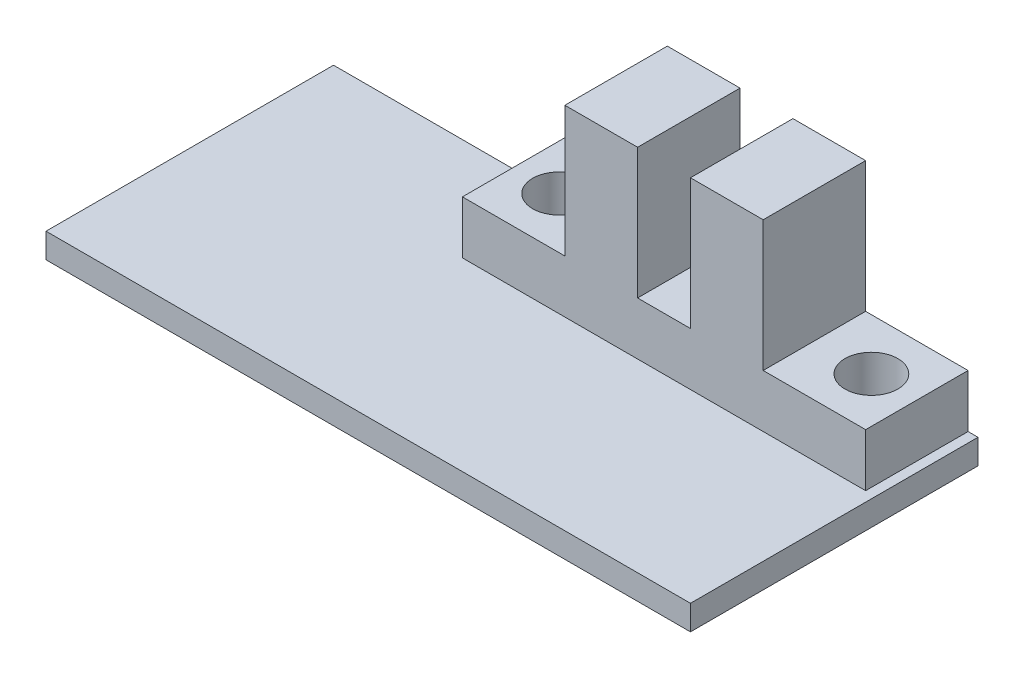
ISO-10303-21;
HEADER;
FILE_DESCRIPTION(('STEP AP214'),'2;1');
FILE_NAME('part.step','',(''),(''),'','','');
FILE_SCHEMA(('AUTOMOTIVE_DESIGN { 1 0 10303 214 1 1 1 1 }'));
ENDSEC;
DATA;
#1=APPLICATION_CONTEXT('core data for automotive mechanical design processes');
#2=APPLICATION_PROTOCOL_DEFINITION('international standard','automotive_design',2000,#1);
#3=PRODUCT_CONTEXT('',#1,'mechanical');
#4=PRODUCT('Part','Part','',(#3));
#5=PRODUCT_RELATED_PRODUCT_CATEGORY('part','',(#4));
#6=PRODUCT_DEFINITION_FORMATION('','',#4);
#7=PRODUCT_DEFINITION_CONTEXT('part definition',#1,'design');
#8=PRODUCT_DEFINITION('design','',#6,#7);
#9=PRODUCT_DEFINITION_SHAPE('','',#8);
#10=(LENGTH_UNIT() NAMED_UNIT(*) SI_UNIT(.MILLI.,.METRE.));
#11=(NAMED_UNIT(*) PLANE_ANGLE_UNIT() SI_UNIT($,.RADIAN.));
#12=(NAMED_UNIT(*) SI_UNIT($,.STERADIAN.) SOLID_ANGLE_UNIT());
#13=UNCERTAINTY_MEASURE_WITH_UNIT(LENGTH_MEASURE(1.E-05),#10,'distance_accuracy_value','');
#14=(GEOMETRIC_REPRESENTATION_CONTEXT(3) GLOBAL_UNCERTAINTY_ASSIGNED_CONTEXT((#13)) GLOBAL_UNIT_ASSIGNED_CONTEXT((#10,
#11,#12)) REPRESENTATION_CONTEXT('',''));
#15=CARTESIAN_POINT('',(0.,0.,0.));
#16=DIRECTION('',(0.,0.,1.));
#17=DIRECTION('',(1.,0.,0.));
#18=AXIS2_PLACEMENT_3D('',#15,#16,#17);
#19=CARTESIAN_POINT('',(0.,4.7,0.));
#20=DIRECTION('',(0.,1.,0.));
#21=DIRECTION('',(0.,0.,1.));
#22=AXIS2_PLACEMENT_3D('',#19,#20,#21);
#23=PLANE('',#22);
#24=DIRECTION('',(1.,0.,0.));
#25=VECTOR('',#24,1.);
#26=CARTESIAN_POINT('',(-5.49999999999999,4.7,-2.5));
#27=LINE('',#26,#25);
#28=CARTESIAN_POINT('',(5.10000000000001,4.7,-2.5));
#29=VERTEX_POINT('',#28);
#30=CARTESIAN_POINT('',(8.30000000000001,4.7,-2.5));
#31=VERTEX_POINT('',#30);
#32=EDGE_CURVE('E167',#29,#31,#27,.T.);
#33=ORIENTED_EDGE('',*,*,#32,.T.);
#34=DIRECTION('',(0.,0.,1.));
#35=VECTOR('',#34,1.);
#36=CARTESIAN_POINT('',(8.30000000000001,4.7,-8.7));
#37=LINE('',#36,#35);
#38=CARTESIAN_POINT('',(8.30000000000001,4.7,-8.7));
#39=VERTEX_POINT('',#38);
#40=EDGE_CURVE('E165',#39,#31,#37,.T.);
#41=ORIENTED_EDGE('',*,*,#40,.F.);
#42=DIRECTION('',(-1.,0.,0.));
#43=VECTOR('',#42,1.);
#44=CARTESIAN_POINT('',(-5.49999999999999,4.7,-8.7));
#45=LINE('',#44,#43);
#46=CARTESIAN_POINT('',(5.10000000000001,4.7,-8.7));
#47=VERTEX_POINT('',#46);
#48=EDGE_CURVE('E150',#39,#47,#45,.T.);
#49=ORIENTED_EDGE('',*,*,#48,.T.);
#50=DIRECTION('',(0.,0.,-1.));
#51=VECTOR('',#50,1.);
#52=CARTESIAN_POINT('',(5.10000000000001,4.7,-8.7));
#53=LINE('',#52,#51);
#54=EDGE_CURVE('E195',#29,#47,#53,.T.);
#55=ORIENTED_EDGE('',*,*,#54,.F.);
#56=EDGE_LOOP('',(#33,#41,#49,#55));
#57=FACE_BOUND('',#56,.T.);
#58=ADVANCED_FACE('F39',(#57),#23,.T.);
#59=CARTESIAN_POINT('',(16.15,4.7,-5.6));
#60=DIRECTION('',(0.,1.,0.));
#61=DIRECTION('',(0.,0.,1.));
#62=AXIS2_PLACEMENT_3D('',#59,#60,#61);
#63=CIRCLE('',#62,1.6);
#64=CARTESIAN_POINT('',(16.15,4.7,-4.));
#65=VERTEX_POINT('',#64);
#66=EDGE_CURVE('E328',#65,#65,#63,.T.);
#67=ORIENTED_EDGE('',*,*,#66,.F.);
#68=EDGE_LOOP('',(#67));
#69=FACE_BOUND('',#68,.T.);
#70=CARTESIAN_POINT('',(18.9,4.7,-8.7));
#71=VERTEX_POINT('',#70);
#72=CARTESIAN_POINT('',(12.7,4.7,-8.7));
#73=VERTEX_POINT('',#72);
#74=EDGE_CURVE('E54',#71,#73,#45,.T.);
#75=ORIENTED_EDGE('',*,*,#74,.T.);
#76=DIRECTION('',(0.,0.,-1.));
#77=VECTOR('',#76,1.);
#78=CARTESIAN_POINT('',(12.7,4.7,-8.7));
#79=LINE('',#78,#77);
#80=CARTESIAN_POINT('',(12.7,4.7,-2.5));
#81=VERTEX_POINT('',#80);
#82=EDGE_CURVE('E58',#81,#73,#79,.T.);
#83=ORIENTED_EDGE('',*,*,#82,.F.);
#84=CARTESIAN_POINT('',(18.9,4.7,-2.5));
#85=VERTEX_POINT('',#84);
#86=EDGE_CURVE('E218',#81,#85,#27,.T.);
#87=ORIENTED_EDGE('',*,*,#86,.T.);
#88=DIRECTION('',(0.,0.,-1.));
#89=VECTOR('',#88,1.);
#90=CARTESIAN_POINT('',(18.9,4.7,-8.7));
#91=LINE('',#90,#89);
#92=EDGE_CURVE('E222',#85,#71,#91,.T.);
#93=ORIENTED_EDGE('',*,*,#92,.T.);
#94=EDGE_LOOP('',(#75,#83,#87,#93));
#95=FACE_BOUND('',#94,.T.);
#96=ADVANCED_FACE('F311',(#69,#95),#23,.T.);
#97=CARTESIAN_POINT('',(-2.74999999999999,4.7,-5.6));
#98=DIRECTION('',(0.,1.,0.));
#99=DIRECTION('',(0.,0.,1.));
#100=AXIS2_PLACEMENT_3D('',#97,#98,#99);
#101=CIRCLE('',#100,1.6);
#102=CARTESIAN_POINT('',(-2.74999999999999,4.7,-4.));
#103=VERTEX_POINT('',#102);
#104=EDGE_CURVE('E331',#103,#103,#101,.T.);
#105=ORIENTED_EDGE('',*,*,#104,.F.);
#106=EDGE_LOOP('',(#105));
#107=FACE_BOUND('',#106,.T.);
#108=DIRECTION('',(0.,0.,1.));
#109=VECTOR('',#108,1.);
#110=CARTESIAN_POINT('',(0.700000000000006,4.7,-8.7));
#111=LINE('',#110,#109);
#112=CARTESIAN_POINT('',(0.700000000000006,4.7,-8.7));
#113=VERTEX_POINT('',#112);
#114=CARTESIAN_POINT('',(0.700000000000006,4.7,-2.5));
#115=VERTEX_POINT('',#114);
#116=EDGE_CURVE('E171',#113,#115,#111,.T.);
#117=ORIENTED_EDGE('',*,*,#116,.F.);
#118=CARTESIAN_POINT('',(-5.49999999999999,4.7,-8.7));
#119=VERTEX_POINT('',#118);
#120=EDGE_CURVE('E162',#113,#119,#45,.T.);
#121=ORIENTED_EDGE('',*,*,#120,.T.);
#122=DIRECTION('',(0.,0.,1.));
#123=VECTOR('',#122,1.);
#124=CARTESIAN_POINT('',(-5.49999999999999,4.7,-8.7));
#125=LINE('',#124,#123);
#126=CARTESIAN_POINT('',(-5.49999999999999,4.7,-2.5));
#127=VERTEX_POINT('',#126);
#128=EDGE_CURVE('E215',#119,#127,#125,.T.);
#129=ORIENTED_EDGE('',*,*,#128,.T.);
#130=EDGE_CURVE('E220',#127,#115,#27,.T.);
#131=ORIENTED_EDGE('',*,*,#130,.T.);
#132=EDGE_LOOP('',(#117,#121,#129,#131));
#133=FACE_BOUND('',#132,.T.);
#134=ADVANCED_FACE('F295',(#107,#133),#23,.T.);
#135=CARTESIAN_POINT('',(19.5,1.5,-8.7));
#136=DIRECTION('',(-1.,0.,0.));
#137=DIRECTION('',(0.,0.,1.));
#138=AXIS2_PLACEMENT_3D('',#135,#136,#137);
#139=PLANE('',#138);
#140=DIRECTION('',(0.,0.,-1.));
#141=VECTOR('',#140,1.);
#142=CARTESIAN_POINT('',(19.5,0.,-8.7));
#143=LINE('',#142,#141);
#144=CARTESIAN_POINT('',(19.5,0.,8.7));
#145=VERTEX_POINT('',#144);
#146=CARTESIAN_POINT('',(19.5,0.,-8.7));
#147=VERTEX_POINT('',#146);
#148=EDGE_CURVE('E243',#145,#147,#143,.T.);
#149=ORIENTED_EDGE('',*,*,#148,.T.);
#150=DIRECTION('',(0.,-1.,0.));
#151=VECTOR('',#150,1.);
#152=CARTESIAN_POINT('',(19.5,1.5,-8.7));
#153=LINE('',#152,#151);
#154=CARTESIAN_POINT('',(19.5,1.5,-8.7));
#155=VERTEX_POINT('',#154);
#156=EDGE_CURVE('E11',#155,#147,#153,.T.);
#157=ORIENTED_EDGE('',*,*,#156,.F.);
#158=DIRECTION('',(0.,0.,-1.));
#159=VECTOR('',#158,1.);
#160=CARTESIAN_POINT('',(19.5,1.5,-8.7));
#161=LINE('',#160,#159);
#162=CARTESIAN_POINT('',(19.5,1.5,8.7));
#163=VERTEX_POINT('',#162);
#164=EDGE_CURVE('E244',#163,#155,#161,.T.);
#165=ORIENTED_EDGE('',*,*,#164,.F.);
#166=DIRECTION('',(0.,-1.,0.));
#167=VECTOR('',#166,1.);
#168=CARTESIAN_POINT('',(19.5,1.5,8.7));
#169=LINE('',#168,#167);
#170=EDGE_CURVE('E255',#163,#145,#169,.T.);
#171=ORIENTED_EDGE('',*,*,#170,.T.);
#172=EDGE_LOOP('',(#149,#157,#165,#171));
#173=FACE_BOUND('',#172,.T.);
#174=ADVANCED_FACE('F41',(#173),#139,.F.);
#175=CARTESIAN_POINT('',(-19.5,1.5,-8.7));
#176=DIRECTION('',(0.,0.,1.));
#177=DIRECTION('',(1.,0.,0.));
#178=AXIS2_PLACEMENT_3D('',#175,#176,#177);
#179=PLANE('',#178);
#180=DIRECTION('',(-1.,0.,0.));
#181=VECTOR('',#180,1.);
#182=CARTESIAN_POINT('',(-19.5,0.,-8.7));
#183=LINE('',#182,#181);
#184=CARTESIAN_POINT('',(-19.5,0.,-8.7));
#185=VERTEX_POINT('',#184);
#186=EDGE_CURVE('E258',#147,#185,#183,.T.);
#187=ORIENTED_EDGE('',*,*,#186,.T.);
#188=DIRECTION('',(0.,-1.,0.));
#189=VECTOR('',#188,1.);
#190=CARTESIAN_POINT('',(-19.5,1.5,-8.7));
#191=LINE('',#190,#189);
#192=CARTESIAN_POINT('',(-19.5,1.5,-8.7));
#193=VERTEX_POINT('',#192);
#194=EDGE_CURVE('E47',#193,#185,#191,.T.);
#195=ORIENTED_EDGE('',*,*,#194,.F.);
#196=DIRECTION('',(-1.,0.,0.));
#197=VECTOR('',#196,1.);
#198=CARTESIAN_POINT('',(-19.5,1.5,-8.7));
#199=LINE('',#198,#197);
#200=CARTESIAN_POINT('',(-5.49999999999999,1.5,-8.7));
#201=VERTEX_POINT('',#200);
#202=EDGE_CURVE('E247',#201,#193,#199,.T.);
#203=ORIENTED_EDGE('',*,*,#202,.F.);
#204=DIRECTION('',(0.,-1.,0.));
#205=VECTOR('',#204,1.);
#206=CARTESIAN_POINT('',(-5.49999999999999,4.7,-8.7));
#207=LINE('',#206,#205);
#208=EDGE_CURVE('E224',#119,#201,#207,.T.);
#209=ORIENTED_EDGE('',*,*,#208,.F.);
#210=ORIENTED_EDGE('',*,*,#120,.F.);
#211=DIRECTION('',(0.,-1.,0.));
#212=VECTOR('',#211,1.);
#213=CARTESIAN_POINT('',(0.700000000000006,12.6,-8.7));
#214=LINE('',#213,#212);
#215=CARTESIAN_POINT('',(0.700000000000006,12.6,-8.7));
#216=VERTEX_POINT('',#215);
#217=EDGE_CURVE('E201',#216,#113,#214,.T.);
#218=ORIENTED_EDGE('',*,*,#217,.F.);
#219=DIRECTION('',(-1.,0.,0.));
#220=VECTOR('',#219,1.);
#221=CARTESIAN_POINT('',(0.700000000000006,12.6,-8.7));
#222=LINE('',#221,#220);
#223=CARTESIAN_POINT('',(5.10000000000001,12.6,-8.7));
#224=VERTEX_POINT('',#223);
#225=EDGE_CURVE('E199',#224,#216,#222,.T.);
#226=ORIENTED_EDGE('',*,*,#225,.F.);
#227=DIRECTION('',(0.,-1.,0.));
#228=VECTOR('',#227,1.);
#229=CARTESIAN_POINT('',(5.10000000000001,12.6,-8.7));
#230=LINE('',#229,#228);
#231=EDGE_CURVE('E159',#224,#47,#230,.T.);
#232=ORIENTED_EDGE('',*,*,#231,.T.);
#233=ORIENTED_EDGE('',*,*,#48,.F.);
#234=DIRECTION('',(0.,-1.,0.));
#235=VECTOR('',#234,1.);
#236=CARTESIAN_POINT('',(8.30000000000001,12.6,-8.7));
#237=LINE('',#236,#235);
#238=CARTESIAN_POINT('',(8.30000000000001,12.6,-8.7));
#239=VERTEX_POINT('',#238);
#240=EDGE_CURVE('E155',#239,#39,#237,.T.);
#241=ORIENTED_EDGE('',*,*,#240,.F.);
#242=DIRECTION('',(-1.,0.,0.));
#243=VECTOR('',#242,1.);
#244=CARTESIAN_POINT('',(8.30000000000001,12.6,-8.7));
#245=LINE('',#244,#243);
#246=CARTESIAN_POINT('',(12.7,12.6,-8.7));
#247=VERTEX_POINT('',#246);
#248=EDGE_CURVE('E176',#247,#239,#245,.T.);
#249=ORIENTED_EDGE('',*,*,#248,.F.);
#250=DIRECTION('',(0.,-1.,0.));
#251=VECTOR('',#250,1.);
#252=CARTESIAN_POINT('',(12.7,12.6,-8.7));
#253=LINE('',#252,#251);
#254=EDGE_CURVE('E177',#247,#73,#253,.T.);
#255=ORIENTED_EDGE('',*,*,#254,.T.);
#256=ORIENTED_EDGE('',*,*,#74,.F.);
#257=DIRECTION('',(0.,-1.,0.));
#258=VECTOR('',#257,1.);
#259=CARTESIAN_POINT('',(18.9,4.7,-8.7));
#260=LINE('',#259,#258);
#261=CARTESIAN_POINT('',(18.9,1.5,-8.7));
#262=VERTEX_POINT('',#261);
#263=EDGE_CURVE('E234',#71,#262,#260,.T.);
#264=ORIENTED_EDGE('',*,*,#263,.T.);
#265=EDGE_CURVE('E249',#155,#262,#199,.T.);
#266=ORIENTED_EDGE('',*,*,#265,.F.);
#267=ORIENTED_EDGE('',*,*,#156,.T.);
#268=EDGE_LOOP('',(#187,#195,#203,#209,#210,#218,#226,#232,#233,#241,#249,#255,#256,#264,#266,#267));
#269=FACE_BOUND('',#268,.T.);
#270=ADVANCED_FACE('F152',(#269),#179,.F.);
#271=CARTESIAN_POINT('',(-19.5,1.5,-8.7));
#272=DIRECTION('',(1.,0.,0.));
#273=DIRECTION('',(0.,0.,-1.));
#274=AXIS2_PLACEMENT_3D('',#271,#272,#273);
#275=PLANE('',#274);
#276=DIRECTION('',(0.,0.,1.));
#277=VECTOR('',#276,1.);
#278=CARTESIAN_POINT('',(-19.5,0.,-8.7));
#279=LINE('',#278,#277);
#280=CARTESIAN_POINT('',(-19.5,0.,8.7));
#281=VERTEX_POINT('',#280);
#282=EDGE_CURVE('E260',#185,#281,#279,.T.);
#283=ORIENTED_EDGE('',*,*,#282,.T.);
#284=DIRECTION('',(0.,-1.,0.));
#285=VECTOR('',#284,1.);
#286=CARTESIAN_POINT('',(-19.5,1.5,8.7));
#287=LINE('',#286,#285);
#288=CARTESIAN_POINT('',(-19.5,1.5,8.7));
#289=VERTEX_POINT('',#288);
#290=EDGE_CURVE('E265',#289,#281,#287,.T.);
#291=ORIENTED_EDGE('',*,*,#290,.F.);
#292=DIRECTION('',(0.,0.,1.));
#293=VECTOR('',#292,1.);
#294=CARTESIAN_POINT('',(-19.5,1.5,-8.7));
#295=LINE('',#294,#293);
#296=EDGE_CURVE('E251',#193,#289,#295,.T.);
#297=ORIENTED_EDGE('',*,*,#296,.F.);
#298=ORIENTED_EDGE('',*,*,#194,.T.);
#299=EDGE_LOOP('',(#283,#291,#297,#298));
#300=FACE_BOUND('',#299,.T.);
#301=ADVANCED_FACE('F272',(#300),#275,.F.);
#302=CARTESIAN_POINT('',(-19.5,1.5,8.7));
#303=DIRECTION('',(0.,0.,-1.));
#304=DIRECTION('',(-1.,0.,0.));
#305=AXIS2_PLACEMENT_3D('',#302,#303,#304);
#306=PLANE('',#305);
#307=DIRECTION('',(1.,0.,0.));
#308=VECTOR('',#307,1.);
#309=CARTESIAN_POINT('',(-19.5,0.,8.7));
#310=LINE('',#309,#308);
#311=EDGE_CURVE('E248',#281,#145,#310,.T.);
#312=ORIENTED_EDGE('',*,*,#311,.T.);
#313=ORIENTED_EDGE('',*,*,#170,.F.);
#314=DIRECTION('',(1.,0.,0.));
#315=VECTOR('',#314,1.);
#316=CARTESIAN_POINT('',(-19.5,1.5,8.7));
#317=LINE('',#316,#315);
#318=EDGE_CURVE('E253',#289,#163,#317,.T.);
#319=ORIENTED_EDGE('',*,*,#318,.F.);
#320=ORIENTED_EDGE('',*,*,#290,.T.);
#321=EDGE_LOOP('',(#312,#313,#319,#320));
#322=FACE_BOUND('',#321,.T.);
#323=ADVANCED_FACE('F281',(#322),#306,.F.);
#324=CARTESIAN_POINT('',(0.,1.5,0.));
#325=DIRECTION('',(0.,1.,0.));
#326=DIRECTION('',(0.,0.,1.));
#327=AXIS2_PLACEMENT_3D('',#324,#325,#326);
#328=PLANE('',#327);
#329=DIRECTION('',(0.,0.,1.));
#330=VECTOR('',#329,1.);
#331=CARTESIAN_POINT('',(-5.49999999999999,1.5,-8.7));
#332=LINE('',#331,#330);
#333=CARTESIAN_POINT('',(-5.49999999999999,1.5,-2.5));
#334=VERTEX_POINT('',#333);
#335=EDGE_CURVE('E214',#201,#334,#332,.T.);
#336=ORIENTED_EDGE('',*,*,#335,.F.);
#337=ORIENTED_EDGE('',*,*,#202,.T.);
#338=ORIENTED_EDGE('',*,*,#296,.T.);
#339=ORIENTED_EDGE('',*,*,#318,.T.);
#340=ORIENTED_EDGE('',*,*,#164,.T.);
#341=ORIENTED_EDGE('',*,*,#265,.T.);
#342=DIRECTION('',(0.,0.,-1.));
#343=VECTOR('',#342,1.);
#344=CARTESIAN_POINT('',(18.9,1.5,-8.7));
#345=LINE('',#344,#343);
#346=CARTESIAN_POINT('',(18.9,1.5,-2.5));
#347=VERTEX_POINT('',#346);
#348=EDGE_CURVE('E219',#347,#262,#345,.T.);
#349=ORIENTED_EDGE('',*,*,#348,.F.);
#350=DIRECTION('',(1.,0.,0.));
#351=VECTOR('',#350,1.);
#352=CARTESIAN_POINT('',(-5.49999999999999,1.5,-2.5));
#353=LINE('',#352,#351);
#354=EDGE_CURVE('E227',#334,#347,#353,.T.);
#355=ORIENTED_EDGE('',*,*,#354,.F.);
#356=EDGE_LOOP('',(#336,#337,#338,#339,#340,#341,#349,#355));
#357=FACE_BOUND('',#356,.T.);
#358=ADVANCED_FACE('F287',(#357),#328,.T.);
#359=CARTESIAN_POINT('',(0.,0.,0.));
#360=DIRECTION('',(0.,1.,0.));
#361=DIRECTION('',(0.,0.,1.));
#362=AXIS2_PLACEMENT_3D('',#359,#360,#361);
#363=PLANE('',#362);
#364=CARTESIAN_POINT('',(-2.74999999999999,0.,-5.6));
#365=DIRECTION('',(0.,1.,0.));
#366=DIRECTION('',(0.,0.,1.));
#367=AXIS2_PLACEMENT_3D('',#364,#365,#366);
#368=CIRCLE('',#367,1.6);
#369=CARTESIAN_POINT('',(-2.74999999999999,0.,-4.));
#370=VERTEX_POINT('',#369);
#371=EDGE_CURVE('E322',#370,#370,#368,.T.);
#372=ORIENTED_EDGE('',*,*,#371,.T.);
#373=EDGE_LOOP('',(#372));
#374=FACE_BOUND('',#373,.T.);
#375=CARTESIAN_POINT('',(16.15,0.,-5.6));
#376=DIRECTION('',(0.,1.,0.));
#377=DIRECTION('',(0.,0.,1.));
#378=AXIS2_PLACEMENT_3D('',#375,#376,#377);
#379=CIRCLE('',#378,1.6);
#380=CARTESIAN_POINT('',(16.15,0.,-4.));
#381=VERTEX_POINT('',#380);
#382=EDGE_CURVE('E325',#381,#381,#379,.T.);
#383=ORIENTED_EDGE('',*,*,#382,.T.);
#384=EDGE_LOOP('',(#383));
#385=FACE_BOUND('',#384,.T.);
#386=ORIENTED_EDGE('',*,*,#148,.F.);
#387=ORIENTED_EDGE('',*,*,#311,.F.);
#388=ORIENTED_EDGE('',*,*,#282,.F.);
#389=ORIENTED_EDGE('',*,*,#186,.F.);
#390=EDGE_LOOP('',(#386,#387,#388,#389));
#391=FACE_BOUND('',#390,.T.);
#392=ADVANCED_FACE('F278',(#374,#385,#391),#363,.F.);
#393=CARTESIAN_POINT('',(-5.49999999999999,4.7,-8.7));
#394=DIRECTION('',(1.,0.,0.));
#395=DIRECTION('',(0.,0.,-1.));
#396=AXIS2_PLACEMENT_3D('',#393,#394,#395);
#397=PLANE('',#396);
#398=ORIENTED_EDGE('',*,*,#335,.T.);
#399=DIRECTION('',(0.,-1.,0.));
#400=VECTOR('',#399,1.);
#401=CARTESIAN_POINT('',(-5.49999999999999,4.7,-2.5));
#402=LINE('',#401,#400);
#403=EDGE_CURVE('E240',#127,#334,#402,.T.);
#404=ORIENTED_EDGE('',*,*,#403,.F.);
#405=ORIENTED_EDGE('',*,*,#128,.F.);
#406=ORIENTED_EDGE('',*,*,#208,.T.);
#407=EDGE_LOOP('',(#398,#404,#405,#406));
#408=FACE_BOUND('',#407,.T.);
#409=ADVANCED_FACE('F292',(#408),#397,.F.);
#410=CARTESIAN_POINT('',(-5.49999999999999,4.7,-2.5));
#411=DIRECTION('',(0.,0.,-1.));
#412=DIRECTION('',(-1.,0.,0.));
#413=AXIS2_PLACEMENT_3D('',#410,#411,#412);
#414=PLANE('',#413);
#415=ORIENTED_EDGE('',*,*,#354,.T.);
#416=DIRECTION('',(0.,-1.,0.));
#417=VECTOR('',#416,1.);
#418=CARTESIAN_POINT('',(18.9,4.7,-2.5));
#419=LINE('',#418,#417);
#420=EDGE_CURVE('E237',#85,#347,#419,.T.);
#421=ORIENTED_EDGE('',*,*,#420,.F.);
#422=ORIENTED_EDGE('',*,*,#86,.F.);
#423=DIRECTION('',(0.,-1.,0.));
#424=VECTOR('',#423,1.);
#425=CARTESIAN_POINT('',(12.7,12.6,-2.5));
#426=LINE('',#425,#424);
#427=CARTESIAN_POINT('',(12.7,12.6,-2.5));
#428=VERTEX_POINT('',#427);
#429=EDGE_CURVE('E182',#428,#81,#426,.T.);
#430=ORIENTED_EDGE('',*,*,#429,.F.);
#431=DIRECTION('',(1.,0.,0.));
#432=VECTOR('',#431,1.);
#433=CARTESIAN_POINT('',(8.30000000000001,12.6,-2.5));
#434=LINE('',#433,#432);
#435=CARTESIAN_POINT('',(8.30000000000001,12.6,-2.5));
#436=VERTEX_POINT('',#435);
#437=EDGE_CURVE('E188',#436,#428,#434,.T.);
#438=ORIENTED_EDGE('',*,*,#437,.F.);
#439=DIRECTION('',(0.,-1.,0.));
#440=VECTOR('',#439,1.);
#441=CARTESIAN_POINT('',(8.30000000000001,12.6,-2.5));
#442=LINE('',#441,#440);
#443=EDGE_CURVE('E309',#436,#31,#442,.T.);
#444=ORIENTED_EDGE('',*,*,#443,.T.);
#445=ORIENTED_EDGE('',*,*,#32,.F.);
#446=DIRECTION('',(0.,-1.,0.));
#447=VECTOR('',#446,1.);
#448=CARTESIAN_POINT('',(5.10000000000001,12.6,-2.5));
#449=LINE('',#448,#447);
#450=CARTESIAN_POINT('',(5.10000000000001,12.6,-2.5));
#451=VERTEX_POINT('',#450);
#452=EDGE_CURVE('E208',#451,#29,#449,.T.);
#453=ORIENTED_EDGE('',*,*,#452,.F.);
#454=DIRECTION('',(1.,0.,0.));
#455=VECTOR('',#454,1.);
#456=CARTESIAN_POINT('',(0.700000000000006,12.6,-2.5));
#457=LINE('',#456,#455);
#458=CARTESIAN_POINT('',(0.700000000000006,12.6,-2.5));
#459=VERTEX_POINT('',#458);
#460=EDGE_CURVE('E194',#459,#451,#457,.T.);
#461=ORIENTED_EDGE('',*,*,#460,.F.);
#462=DIRECTION('',(0.,-1.,0.));
#463=VECTOR('',#462,1.);
#464=CARTESIAN_POINT('',(0.700000000000006,12.6,-2.5));
#465=LINE('',#464,#463);
#466=EDGE_CURVE('E211',#459,#115,#465,.T.);
#467=ORIENTED_EDGE('',*,*,#466,.T.);
#468=ORIENTED_EDGE('',*,*,#130,.F.);
#469=ORIENTED_EDGE('',*,*,#403,.T.);
#470=EDGE_LOOP('',(#415,#421,#422,#430,#438,#444,#445,#453,#461,#467,#468,#469));
#471=FACE_BOUND('',#470,.T.);
#472=ADVANCED_FACE('F308',(#471),#414,.F.);
#473=CARTESIAN_POINT('',(18.9,4.7,-8.7));
#474=DIRECTION('',(-1.,0.,0.));
#475=DIRECTION('',(0.,0.,1.));
#476=AXIS2_PLACEMENT_3D('',#473,#474,#475);
#477=PLANE('',#476);
#478=ORIENTED_EDGE('',*,*,#348,.T.);
#479=ORIENTED_EDGE('',*,*,#263,.F.);
#480=ORIENTED_EDGE('',*,*,#92,.F.);
#481=ORIENTED_EDGE('',*,*,#420,.T.);
#482=EDGE_LOOP('',(#478,#479,#480,#481));
#483=FACE_BOUND('',#482,.T.);
#484=ADVANCED_FACE('F317',(#483),#477,.F.);
#485=CARTESIAN_POINT('',(0.700000000000006,12.6,-8.7));
#486=DIRECTION('',(1.,0.,0.));
#487=DIRECTION('',(0.,0.,-1.));
#488=AXIS2_PLACEMENT_3D('',#485,#486,#487);
#489=PLANE('',#488);
#490=ORIENTED_EDGE('',*,*,#116,.T.);
#491=ORIENTED_EDGE('',*,*,#466,.F.);
#492=DIRECTION('',(0.,0.,1.));
#493=VECTOR('',#492,1.);
#494=CARTESIAN_POINT('',(0.700000000000006,12.6,-8.7));
#495=LINE('',#494,#493);
#496=EDGE_CURVE('E191',#216,#459,#495,.T.);
#497=ORIENTED_EDGE('',*,*,#496,.F.);
#498=ORIENTED_EDGE('',*,*,#217,.T.);
#499=EDGE_LOOP('',(#490,#491,#497,#498));
#500=FACE_BOUND('',#499,.T.);
#501=ADVANCED_FACE('F299',(#500),#489,.F.);
#502=CARTESIAN_POINT('',(5.10000000000001,12.6,-8.7));
#503=DIRECTION('',(-1.,0.,0.));
#504=DIRECTION('',(0.,0.,1.));
#505=AXIS2_PLACEMENT_3D('',#502,#503,#504);
#506=PLANE('',#505);
#507=ORIENTED_EDGE('',*,*,#54,.T.);
#508=ORIENTED_EDGE('',*,*,#231,.F.);
#509=DIRECTION('',(0.,0.,-1.));
#510=VECTOR('',#509,1.);
#511=CARTESIAN_POINT('',(5.10000000000001,12.6,-8.7));
#512=LINE('',#511,#510);
#513=EDGE_CURVE('E197',#451,#224,#512,.T.);
#514=ORIENTED_EDGE('',*,*,#513,.F.);
#515=ORIENTED_EDGE('',*,*,#452,.T.);
#516=EDGE_LOOP('',(#507,#508,#514,#515));
#517=FACE_BOUND('',#516,.T.);
#518=ADVANCED_FACE('F306',(#517),#506,.F.);
#519=CARTESIAN_POINT('',(0.,12.6,0.));
#520=DIRECTION('',(0.,1.,0.));
#521=DIRECTION('',(0.,0.,1.));
#522=AXIS2_PLACEMENT_3D('',#519,#520,#521);
#523=PLANE('',#522);
#524=ORIENTED_EDGE('',*,*,#496,.T.);
#525=ORIENTED_EDGE('',*,*,#460,.T.);
#526=ORIENTED_EDGE('',*,*,#513,.T.);
#527=ORIENTED_EDGE('',*,*,#225,.T.);
#528=EDGE_LOOP('',(#524,#525,#526,#527));
#529=FACE_BOUND('',#528,.T.);
#530=ADVANCED_FACE('F302',(#529),#523,.T.);
#531=CARTESIAN_POINT('',(8.30000000000001,12.6,-8.7));
#532=DIRECTION('',(1.,0.,0.));
#533=DIRECTION('',(0.,0.,-1.));
#534=AXIS2_PLACEMENT_3D('',#531,#532,#533);
#535=PLANE('',#534);
#536=ORIENTED_EDGE('',*,*,#40,.T.);
#537=ORIENTED_EDGE('',*,*,#443,.F.);
#538=DIRECTION('',(0.,0.,1.));
#539=VECTOR('',#538,1.);
#540=CARTESIAN_POINT('',(8.30000000000001,12.6,-8.7));
#541=LINE('',#540,#539);
#542=EDGE_CURVE('E175',#239,#436,#541,.T.);
#543=ORIENTED_EDGE('',*,*,#542,.F.);
#544=ORIENTED_EDGE('',*,*,#240,.T.);
#545=EDGE_LOOP('',(#536,#537,#543,#544));
#546=FACE_BOUND('',#545,.T.);
#547=ADVANCED_FACE('F173',(#546),#535,.F.);
#548=CARTESIAN_POINT('',(12.7,12.6,-8.7));
#549=DIRECTION('',(-1.,0.,0.));
#550=DIRECTION('',(0.,0.,1.));
#551=AXIS2_PLACEMENT_3D('',#548,#549,#550);
#552=PLANE('',#551);
#553=ORIENTED_EDGE('',*,*,#82,.T.);
#554=ORIENTED_EDGE('',*,*,#254,.F.);
#555=DIRECTION('',(0.,0.,-1.));
#556=VECTOR('',#555,1.);
#557=CARTESIAN_POINT('',(12.7,12.6,-8.7));
#558=LINE('',#557,#556);
#559=EDGE_CURVE('E179',#428,#247,#558,.T.);
#560=ORIENTED_EDGE('',*,*,#559,.F.);
#561=ORIENTED_EDGE('',*,*,#429,.T.);
#562=EDGE_LOOP('',(#553,#554,#560,#561));
#563=FACE_BOUND('',#562,.T.);
#564=ADVANCED_FACE('F321',(#563),#552,.F.);
#565=CARTESIAN_POINT('',(0.,12.6,0.));
#566=DIRECTION('',(0.,1.,0.));
#567=DIRECTION('',(0.,0.,1.));
#568=AXIS2_PLACEMENT_3D('',#565,#566,#567);
#569=PLANE('',#568);
#570=ORIENTED_EDGE('',*,*,#542,.T.);
#571=ORIENTED_EDGE('',*,*,#437,.T.);
#572=ORIENTED_EDGE('',*,*,#559,.T.);
#573=ORIENTED_EDGE('',*,*,#248,.T.);
#574=EDGE_LOOP('',(#570,#571,#572,#573));
#575=FACE_BOUND('',#574,.T.);
#576=ADVANCED_FACE('F410',(#575),#569,.T.);
#577=CARTESIAN_POINT('',(16.15,0.,-5.6));
#578=DIRECTION('',(0.,1.,0.));
#579=DIRECTION('',(0.,0.,1.));
#580=AXIS2_PLACEMENT_3D('',#577,#578,#579);
#581=CYLINDRICAL_SURFACE('',#580,1.6);
#582=ORIENTED_EDGE('',*,*,#382,.F.);
#583=EDGE_LOOP('',(#582));
#584=FACE_BOUND('',#583,.T.);
#585=ORIENTED_EDGE('',*,*,#66,.T.);
#586=EDGE_LOOP('',(#585));
#587=FACE_BOUND('',#586,.T.);
#588=ADVANCED_FACE('F342',(#584,#587),#581,.F.);
#589=CARTESIAN_POINT('',(-2.74999999999999,0.,-5.6));
#590=DIRECTION('',(0.,1.,0.));
#591=DIRECTION('',(0.,0.,1.));
#592=AXIS2_PLACEMENT_3D('',#589,#590,#591);
#593=CYLINDRICAL_SURFACE('',#592,1.6);
#594=ORIENTED_EDGE('',*,*,#371,.F.);
#595=EDGE_LOOP('',(#594));
#596=FACE_BOUND('',#595,.T.);
#597=ORIENTED_EDGE('',*,*,#104,.T.);
#598=EDGE_LOOP('',(#597));
#599=FACE_BOUND('',#598,.T.);
#600=ADVANCED_FACE('F339',(#596,#599),#593,.F.);
#601=CLOSED_SHELL('',(#58,#96,#134,#174,#270,#301,#323,#358,#392,#409,#472,#484,#501,#518,#530,
#547,#564,#576,#588,#600));
#602=MANIFOLD_SOLID_BREP('B2',#601);
#603=ADVANCED_BREP_SHAPE_REPRESENTATION('',(#18,#602),#14);
#604=SHAPE_DEFINITION_REPRESENTATION(#9,#603);
ENDSEC;
END-ISO-10303-21;
